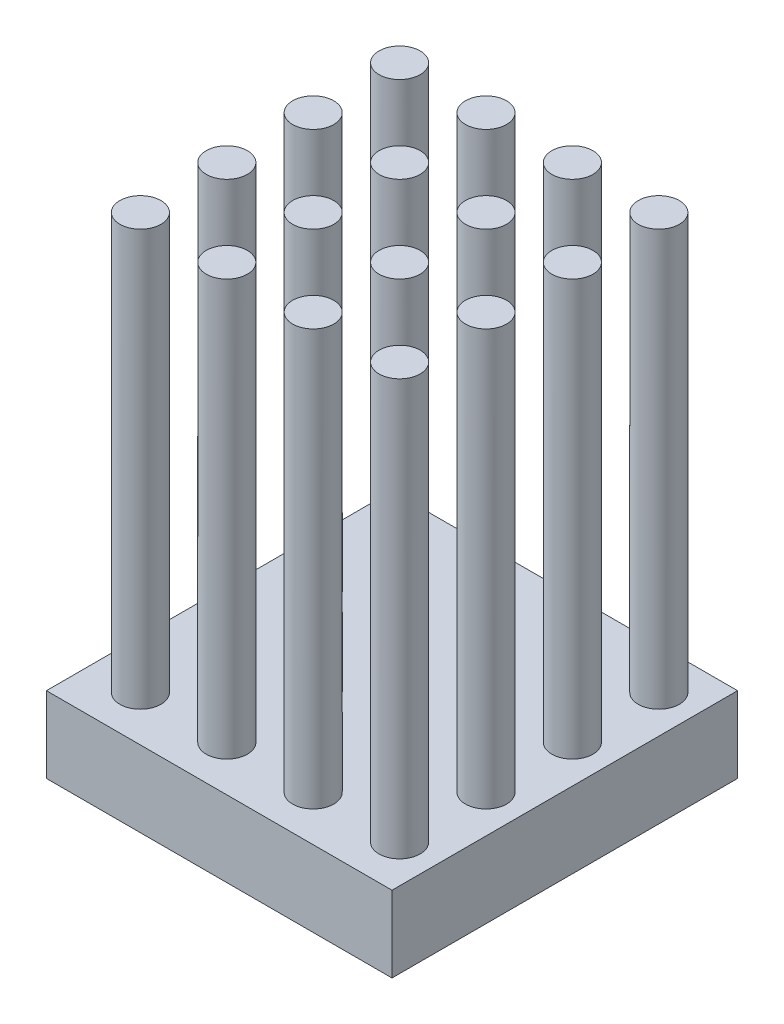
ISO-10303-21;
HEADER;
FILE_DESCRIPTION(('STEP AP214'),'2;1');
FILE_NAME('part.step','',(''),(''),'','','');
FILE_SCHEMA(('AUTOMOTIVE_DESIGN { 1 0 10303 214 1 1 1 1 }'));
ENDSEC;
DATA;
#1=APPLICATION_CONTEXT('core data for automotive mechanical design processes');
#2=APPLICATION_PROTOCOL_DEFINITION('international standard','automotive_design',2000,#1);
#3=PRODUCT_CONTEXT('',#1,'mechanical');
#4=PRODUCT('Part','Part','',(#3));
#5=PRODUCT_RELATED_PRODUCT_CATEGORY('part','',(#4));
#6=PRODUCT_DEFINITION_FORMATION('','',#4);
#7=PRODUCT_DEFINITION_CONTEXT('part definition',#1,'design');
#8=PRODUCT_DEFINITION('design','',#6,#7);
#9=PRODUCT_DEFINITION_SHAPE('','',#8);
#10=(LENGTH_UNIT() NAMED_UNIT(*) SI_UNIT(.MILLI.,.METRE.));
#11=(NAMED_UNIT(*) PLANE_ANGLE_UNIT() SI_UNIT($,.RADIAN.));
#12=(NAMED_UNIT(*) SI_UNIT($,.STERADIAN.) SOLID_ANGLE_UNIT());
#13=UNCERTAINTY_MEASURE_WITH_UNIT(LENGTH_MEASURE(1.E-05),#10,'distance_accuracy_value','');
#14=(GEOMETRIC_REPRESENTATION_CONTEXT(3) GLOBAL_UNCERTAINTY_ASSIGNED_CONTEXT((#13)) GLOBAL_UNIT_ASSIGNED_CONTEXT((#10,
#11,#12)) REPRESENTATION_CONTEXT('',''));
#15=CARTESIAN_POINT('',(0.,0.,0.));
#16=DIRECTION('',(0.,0.,1.));
#17=DIRECTION('',(1.,0.,0.));
#18=AXIS2_PLACEMENT_3D('',#15,#16,#17);
#19=CARTESIAN_POINT('',(0.,2.2,0.));
#20=DIRECTION('',(0.,-1.,0.));
#21=DIRECTION('',(0.,0.,-1.));
#22=AXIS2_PLACEMENT_3D('',#19,#20,#21);
#23=PLANE('',#22);
#24=CARTESIAN_POINT('',(-3.595,2.2,3.685));
#25=DIRECTION('',(0.,-1.,0.));
#26=DIRECTION('',(0.,0.,-1.));
#27=AXIS2_PLACEMENT_3D('',#24,#25,#26);
#28=CIRCLE('',#27,0.595);
#29=CARTESIAN_POINT('',(-3.595,2.2,3.09));
#30=VERTEX_POINT('',#29);
#31=EDGE_CURVE('E122',#30,#30,#28,.F.);
#32=ORIENTED_EDGE('',*,*,#31,.F.);
#33=EDGE_LOOP('',(#32));
#34=FACE_BOUND('',#33,.T.);
#35=DIRECTION('',(0.,0.,1.));
#36=VECTOR('',#35,1.);
#37=CARTESIAN_POINT('',(-5.,2.2,-5.));
#38=LINE('',#37,#36);
#39=CARTESIAN_POINT('',(-5.,2.2,-5.));
#40=VERTEX_POINT('',#39);
#41=CARTESIAN_POINT('',(-5.,2.2,5.));
#42=VERTEX_POINT('',#41);
#43=EDGE_CURVE('E97',#40,#42,#38,.T.);
#44=ORIENTED_EDGE('',*,*,#43,.T.);
#45=DIRECTION('',(1.,0.,0.));
#46=VECTOR('',#45,1.);
#47=CARTESIAN_POINT('',(5.,2.2,5.));
#48=LINE('',#47,#46);
#49=CARTESIAN_POINT('',(5.,2.2,5.));
#50=VERTEX_POINT('',#49);
#51=EDGE_CURVE('E92',#42,#50,#48,.T.);
#52=ORIENTED_EDGE('',*,*,#51,.T.);
#53=DIRECTION('',(0.,0.,-1.));
#54=VECTOR('',#53,1.);
#55=CARTESIAN_POINT('',(5.,2.2,-5.));
#56=LINE('',#55,#54);
#57=CARTESIAN_POINT('',(5.,2.2,-5.));
#58=VERTEX_POINT('',#57);
#59=EDGE_CURVE('E95',#50,#58,#56,.T.);
#60=ORIENTED_EDGE('',*,*,#59,.T.);
#61=DIRECTION('',(-1.,0.,0.));
#62=VECTOR('',#61,1.);
#63=CARTESIAN_POINT('',(5.,2.2,-5.));
#64=LINE('',#63,#62);
#65=EDGE_CURVE('E61',#58,#40,#64,.T.);
#66=ORIENTED_EDGE('',*,*,#65,.T.);
#67=EDGE_LOOP('',(#44,#52,#60,#66));
#68=FACE_BOUND('',#67,.T.);
#69=CARTESIAN_POINT('',(-1.095,2.2,3.685));
#70=DIRECTION('',(0.,-1.,0.));
#71=DIRECTION('',(0.,0.,-1.));
#72=AXIS2_PLACEMENT_3D('',#69,#70,#71);
#73=CIRCLE('',#72,0.595);
#74=CARTESIAN_POINT('',(-1.095,2.2,3.09));
#75=VERTEX_POINT('',#74);
#76=EDGE_CURVE('E125',#75,#75,#73,.F.);
#77=ORIENTED_EDGE('',*,*,#76,.F.);
#78=EDGE_LOOP('',(#77));
#79=FACE_BOUND('',#78,.T.);
#80=CARTESIAN_POINT('',(1.405,2.2,3.685));
#81=DIRECTION('',(0.,-1.,0.));
#82=DIRECTION('',(0.,0.,-1.));
#83=AXIS2_PLACEMENT_3D('',#80,#81,#82);
#84=CIRCLE('',#83,0.595);
#85=CARTESIAN_POINT('',(1.405,2.2,3.09));
#86=VERTEX_POINT('',#85);
#87=EDGE_CURVE('E128',#86,#86,#84,.F.);
#88=ORIENTED_EDGE('',*,*,#87,.F.);
#89=EDGE_LOOP('',(#88));
#90=FACE_BOUND('',#89,.T.);
#91=CARTESIAN_POINT('',(3.905,2.2,3.685));
#92=DIRECTION('',(0.,-1.,0.));
#93=DIRECTION('',(0.,0.,-1.));
#94=AXIS2_PLACEMENT_3D('',#91,#92,#93);
#95=CIRCLE('',#94,0.595);
#96=CARTESIAN_POINT('',(3.905,2.2,3.09));
#97=VERTEX_POINT('',#96);
#98=EDGE_CURVE('E134',#97,#97,#95,.F.);
#99=ORIENTED_EDGE('',*,*,#98,.F.);
#100=EDGE_LOOP('',(#99));
#101=FACE_BOUND('',#100,.T.);
#102=CARTESIAN_POINT('',(-3.595,2.2,1.185));
#103=DIRECTION('',(0.,-1.,0.));
#104=DIRECTION('',(0.,0.,-1.));
#105=AXIS2_PLACEMENT_3D('',#102,#103,#104);
#106=CIRCLE('',#105,0.595);
#107=CARTESIAN_POINT('',(-3.595,2.2,0.590000000000001));
#108=VERTEX_POINT('',#107);
#109=EDGE_CURVE('E140',#108,#108,#106,.F.);
#110=ORIENTED_EDGE('',*,*,#109,.F.);
#111=EDGE_LOOP('',(#110));
#112=FACE_BOUND('',#111,.T.);
#113=CARTESIAN_POINT('',(-1.095,2.2,1.185));
#114=DIRECTION('',(0.,-1.,0.));
#115=DIRECTION('',(0.,0.,-1.));
#116=AXIS2_PLACEMENT_3D('',#113,#114,#115);
#117=CIRCLE('',#116,0.595);
#118=CARTESIAN_POINT('',(-1.095,2.2,0.59));
#119=VERTEX_POINT('',#118);
#120=EDGE_CURVE('E146',#119,#119,#117,.F.);
#121=ORIENTED_EDGE('',*,*,#120,.F.);
#122=EDGE_LOOP('',(#121));
#123=FACE_BOUND('',#122,.T.);
#124=CARTESIAN_POINT('',(1.405,2.2,1.185));
#125=DIRECTION('',(0.,-1.,0.));
#126=DIRECTION('',(0.,0.,-1.));
#127=AXIS2_PLACEMENT_3D('',#124,#125,#126);
#128=CIRCLE('',#127,0.595);
#129=CARTESIAN_POINT('',(1.405,2.2,0.59));
#130=VERTEX_POINT('',#129);
#131=EDGE_CURVE('E152',#130,#130,#128,.F.);
#132=ORIENTED_EDGE('',*,*,#131,.F.);
#133=EDGE_LOOP('',(#132));
#134=FACE_BOUND('',#133,.T.);
#135=CARTESIAN_POINT('',(3.905,2.2,1.185));
#136=DIRECTION('',(0.,-1.,0.));
#137=DIRECTION('',(0.,0.,-1.));
#138=AXIS2_PLACEMENT_3D('',#135,#136,#137);
#139=CIRCLE('',#138,0.595);
#140=CARTESIAN_POINT('',(3.905,2.2,0.59));
#141=VERTEX_POINT('',#140);
#142=EDGE_CURVE('E158',#141,#141,#139,.F.);
#143=ORIENTED_EDGE('',*,*,#142,.F.);
#144=EDGE_LOOP('',(#143));
#145=FACE_BOUND('',#144,.T.);
#146=CARTESIAN_POINT('',(-3.595,2.2,-1.315));
#147=DIRECTION('',(0.,-1.,0.));
#148=DIRECTION('',(0.,0.,-1.));
#149=AXIS2_PLACEMENT_3D('',#146,#147,#148);
#150=CIRCLE('',#149,0.595);
#151=CARTESIAN_POINT('',(-3.595,2.2,-1.91));
#152=VERTEX_POINT('',#151);
#153=EDGE_CURVE('E164',#152,#152,#150,.F.);
#154=ORIENTED_EDGE('',*,*,#153,.F.);
#155=EDGE_LOOP('',(#154));
#156=FACE_BOUND('',#155,.T.);
#157=CARTESIAN_POINT('',(-1.095,2.2,-1.315));
#158=DIRECTION('',(0.,-1.,0.));
#159=DIRECTION('',(0.,0.,-1.));
#160=AXIS2_PLACEMENT_3D('',#157,#158,#159);
#161=CIRCLE('',#160,0.595);
#162=CARTESIAN_POINT('',(-1.095,2.2,-1.91));
#163=VERTEX_POINT('',#162);
#164=EDGE_CURVE('E170',#163,#163,#161,.F.);
#165=ORIENTED_EDGE('',*,*,#164,.F.);
#166=EDGE_LOOP('',(#165));
#167=FACE_BOUND('',#166,.T.);
#168=CARTESIAN_POINT('',(1.405,2.2,-1.315));
#169=DIRECTION('',(0.,-1.,0.));
#170=DIRECTION('',(0.,0.,-1.));
#171=AXIS2_PLACEMENT_3D('',#168,#169,#170);
#172=CIRCLE('',#171,0.595);
#173=CARTESIAN_POINT('',(1.405,2.2,-1.91));
#174=VERTEX_POINT('',#173);
#175=EDGE_CURVE('E176',#174,#174,#172,.F.);
#176=ORIENTED_EDGE('',*,*,#175,.F.);
#177=EDGE_LOOP('',(#176));
#178=FACE_BOUND('',#177,.T.);
#179=CARTESIAN_POINT('',(3.905,2.2,-1.315));
#180=DIRECTION('',(0.,-1.,0.));
#181=DIRECTION('',(0.,0.,-1.));
#182=AXIS2_PLACEMENT_3D('',#179,#180,#181);
#183=CIRCLE('',#182,0.595);
#184=CARTESIAN_POINT('',(3.905,2.2,-1.91));
#185=VERTEX_POINT('',#184);
#186=EDGE_CURVE('E182',#185,#185,#183,.F.);
#187=ORIENTED_EDGE('',*,*,#186,.F.);
#188=EDGE_LOOP('',(#187));
#189=FACE_BOUND('',#188,.T.);
#190=CARTESIAN_POINT('',(-3.595,2.2,-3.815));
#191=DIRECTION('',(0.,-1.,0.));
#192=DIRECTION('',(0.,0.,-1.));
#193=AXIS2_PLACEMENT_3D('',#190,#191,#192);
#194=CIRCLE('',#193,0.595);
#195=CARTESIAN_POINT('',(-3.595,2.2,-4.41));
#196=VERTEX_POINT('',#195);
#197=EDGE_CURVE('E188',#196,#196,#194,.F.);
#198=ORIENTED_EDGE('',*,*,#197,.F.);
#199=EDGE_LOOP('',(#198));
#200=FACE_BOUND('',#199,.T.);
#201=CARTESIAN_POINT('',(-1.095,2.2,-3.815));
#202=DIRECTION('',(0.,-1.,0.));
#203=DIRECTION('',(0.,0.,-1.));
#204=AXIS2_PLACEMENT_3D('',#201,#202,#203);
#205=CIRCLE('',#204,0.595);
#206=CARTESIAN_POINT('',(-1.095,2.2,-4.41));
#207=VERTEX_POINT('',#206);
#208=EDGE_CURVE('E194',#207,#207,#205,.F.);
#209=ORIENTED_EDGE('',*,*,#208,.F.);
#210=EDGE_LOOP('',(#209));
#211=FACE_BOUND('',#210,.T.);
#212=CARTESIAN_POINT('',(1.405,2.2,-3.815));
#213=DIRECTION('',(0.,-1.,0.));
#214=DIRECTION('',(0.,0.,-1.));
#215=AXIS2_PLACEMENT_3D('',#212,#213,#214);
#216=CIRCLE('',#215,0.595);
#217=CARTESIAN_POINT('',(1.405,2.2,-4.41));
#218=VERTEX_POINT('',#217);
#219=EDGE_CURVE('E200',#218,#218,#216,.F.);
#220=ORIENTED_EDGE('',*,*,#219,.F.);
#221=EDGE_LOOP('',(#220));
#222=FACE_BOUND('',#221,.T.);
#223=CARTESIAN_POINT('',(3.905,2.2,-3.815));
#224=DIRECTION('',(0.,-1.,0.));
#225=DIRECTION('',(0.,0.,-1.));
#226=AXIS2_PLACEMENT_3D('',#223,#224,#225);
#227=CIRCLE('',#226,0.595);
#228=CARTESIAN_POINT('',(3.905,2.2,-4.41));
#229=VERTEX_POINT('',#228);
#230=EDGE_CURVE('E53',#229,#229,#227,.F.);
#231=ORIENTED_EDGE('',*,*,#230,.F.);
#232=EDGE_LOOP('',(#231));
#233=FACE_BOUND('',#232,.T.);
#234=ADVANCED_FACE('F44',(#34,#68,#79,#90,#101,#112,#123,#134,#145,#156,#167,#178,#189,#200,
#211,#222,#233),#23,.F.);
#235=CARTESIAN_POINT('',(-5.,2.2,-5.));
#236=DIRECTION('',(1.,0.,0.));
#237=DIRECTION('',(0.,0.,-1.));
#238=AXIS2_PLACEMENT_3D('',#235,#236,#237);
#239=PLANE('',#238);
#240=DIRECTION('',(0.,0.,1.));
#241=VECTOR('',#240,1.);
#242=CARTESIAN_POINT('',(-5.,0.,-5.));
#243=LINE('',#242,#241);
#244=CARTESIAN_POINT('',(-5.,0.,-5.));
#245=VERTEX_POINT('',#244);
#246=CARTESIAN_POINT('',(-5.,0.,5.));
#247=VERTEX_POINT('',#246);
#248=EDGE_CURVE('E112',#245,#247,#243,.T.);
#249=ORIENTED_EDGE('',*,*,#248,.T.);
#250=DIRECTION('',(0.,-1.,0.));
#251=VECTOR('',#250,1.);
#252=CARTESIAN_POINT('',(-5.,2.2,5.));
#253=LINE('',#252,#251);
#254=EDGE_CURVE('E103',#42,#247,#253,.T.);
#255=ORIENTED_EDGE('',*,*,#254,.F.);
#256=ORIENTED_EDGE('',*,*,#43,.F.);
#257=DIRECTION('',(0.,-1.,0.));
#258=VECTOR('',#257,1.);
#259=CARTESIAN_POINT('',(-5.,2.2,-5.));
#260=LINE('',#259,#258);
#261=EDGE_CURVE('E108',#40,#245,#260,.T.);
#262=ORIENTED_EDGE('',*,*,#261,.T.);
#263=EDGE_LOOP('',(#249,#255,#256,#262));
#264=FACE_BOUND('',#263,.T.);
#265=ADVANCED_FACE('F211',(#264),#239,.F.);
#266=CARTESIAN_POINT('',(5.,2.2,5.));
#267=DIRECTION('',(0.,0.,-1.));
#268=DIRECTION('',(-1.,0.,0.));
#269=AXIS2_PLACEMENT_3D('',#266,#267,#268);
#270=PLANE('',#269);
#271=DIRECTION('',(1.,0.,0.));
#272=VECTOR('',#271,1.);
#273=CARTESIAN_POINT('',(5.,0.,5.));
#274=LINE('',#273,#272);
#275=CARTESIAN_POINT('',(5.,0.,5.));
#276=VERTEX_POINT('',#275);
#277=EDGE_CURVE('E102',#247,#276,#274,.T.);
#278=ORIENTED_EDGE('',*,*,#277,.T.);
#279=DIRECTION('',(0.,-1.,0.));
#280=VECTOR('',#279,1.);
#281=CARTESIAN_POINT('',(5.,2.2,5.));
#282=LINE('',#281,#280);
#283=EDGE_CURVE('E100',#50,#276,#282,.T.);
#284=ORIENTED_EDGE('',*,*,#283,.F.);
#285=ORIENTED_EDGE('',*,*,#51,.F.);
#286=ORIENTED_EDGE('',*,*,#254,.T.);
#287=EDGE_LOOP('',(#278,#284,#285,#286));
#288=FACE_BOUND('',#287,.T.);
#289=ADVANCED_FACE('F101',(#288),#270,.F.);
#290=CARTESIAN_POINT('',(5.,2.2,-5.));
#291=DIRECTION('',(-1.,0.,0.));
#292=DIRECTION('',(0.,0.,1.));
#293=AXIS2_PLACEMENT_3D('',#290,#291,#292);
#294=PLANE('',#293);
#295=DIRECTION('',(0.,0.,-1.));
#296=VECTOR('',#295,1.);
#297=CARTESIAN_POINT('',(5.,0.,-5.));
#298=LINE('',#297,#296);
#299=CARTESIAN_POINT('',(5.,0.,-5.));
#300=VERTEX_POINT('',#299);
#301=EDGE_CURVE('E78',#276,#300,#298,.T.);
#302=ORIENTED_EDGE('',*,*,#301,.T.);
#303=DIRECTION('',(0.,-1.,0.));
#304=VECTOR('',#303,1.);
#305=CARTESIAN_POINT('',(5.,2.2,-5.));
#306=LINE('',#305,#304);
#307=EDGE_CURVE('E104',#58,#300,#306,.T.);
#308=ORIENTED_EDGE('',*,*,#307,.F.);
#309=ORIENTED_EDGE('',*,*,#59,.F.);
#310=ORIENTED_EDGE('',*,*,#283,.T.);
#311=EDGE_LOOP('',(#302,#308,#309,#310));
#312=FACE_BOUND('',#311,.T.);
#313=ADVANCED_FACE('F106',(#312),#294,.F.);
#314=CARTESIAN_POINT('',(5.,2.2,-5.));
#315=DIRECTION('',(0.,0.,1.));
#316=DIRECTION('',(1.,0.,0.));
#317=AXIS2_PLACEMENT_3D('',#314,#315,#316);
#318=PLANE('',#317);
#319=DIRECTION('',(-1.,0.,0.));
#320=VECTOR('',#319,1.);
#321=CARTESIAN_POINT('',(5.,0.,-5.));
#322=LINE('',#321,#320);
#323=EDGE_CURVE('E84',#300,#245,#322,.T.);
#324=ORIENTED_EDGE('',*,*,#323,.T.);
#325=ORIENTED_EDGE('',*,*,#261,.F.);
#326=ORIENTED_EDGE('',*,*,#65,.F.);
#327=ORIENTED_EDGE('',*,*,#307,.T.);
#328=EDGE_LOOP('',(#324,#325,#326,#327));
#329=FACE_BOUND('',#328,.T.);
#330=ADVANCED_FACE('F227',(#329),#318,.F.);
#331=CARTESIAN_POINT('',(0.,0.,0.));
#332=DIRECTION('',(0.,-1.,0.));
#333=DIRECTION('',(0.,0.,-1.));
#334=AXIS2_PLACEMENT_3D('',#331,#332,#333);
#335=PLANE('',#334);
#336=ORIENTED_EDGE('',*,*,#248,.F.);
#337=ORIENTED_EDGE('',*,*,#323,.F.);
#338=ORIENTED_EDGE('',*,*,#301,.F.);
#339=ORIENTED_EDGE('',*,*,#277,.F.);
#340=EDGE_LOOP('',(#336,#337,#338,#339));
#341=FACE_BOUND('',#340,.T.);
#342=ADVANCED_FACE('F224',(#341),#335,.T.);
#343=CARTESIAN_POINT('',(-3.595,14.23,3.685));
#344=DIRECTION('',(0.,-1.,0.));
#345=DIRECTION('',(0.,0.,-1.));
#346=AXIS2_PLACEMENT_3D('',#343,#344,#345);
#347=CYLINDRICAL_SURFACE('',#346,0.595);
#348=CARTESIAN_POINT('',(-3.595,14.23,3.685));
#349=DIRECTION('',(0.,1.,0.));
#350=DIRECTION('',(0.,0.,1.));
#351=AXIS2_PLACEMENT_3D('',#348,#349,#350);
#352=CIRCLE('',#351,0.595);
#353=CARTESIAN_POINT('',(-3.595,14.23,4.28));
#354=VERTEX_POINT('',#353);
#355=EDGE_CURVE('E115',#354,#354,#352,.T.);
#356=ORIENTED_EDGE('',*,*,#355,.F.);
#357=EDGE_LOOP('',(#356));
#358=FACE_BOUND('',#357,.T.);
#359=ORIENTED_EDGE('',*,*,#31,.T.);
#360=EDGE_LOOP('',(#359));
#361=FACE_BOUND('',#360,.T.);
#362=ADVANCED_FACE('F222',(#358,#361),#347,.T.);
#363=CARTESIAN_POINT('',(-3.595,14.23,3.685));
#364=DIRECTION('',(0.,1.,0.));
#365=DIRECTION('',(0.,0.,1.));
#366=AXIS2_PLACEMENT_3D('',#363,#364,#365);
#367=PLANE('',#366);
#368=ORIENTED_EDGE('',*,*,#355,.T.);
#369=EDGE_LOOP('',(#368));
#370=FACE_BOUND('',#369,.T.);
#371=ADVANCED_FACE('F466',(#370),#367,.T.);
#372=CARTESIAN_POINT('',(-1.095,14.23,3.685));
#373=DIRECTION('',(0.,-1.,0.));
#374=DIRECTION('',(0.,0.,-1.));
#375=AXIS2_PLACEMENT_3D('',#372,#373,#374);
#376=CYLINDRICAL_SURFACE('',#375,0.595);
#377=CARTESIAN_POINT('',(-1.095,14.23,3.685));
#378=DIRECTION('',(0.,1.,0.));
#379=DIRECTION('',(0.,0.,1.));
#380=AXIS2_PLACEMENT_3D('',#377,#378,#379);
#381=CIRCLE('',#380,0.595);
#382=CARTESIAN_POINT('',(-1.095,14.23,4.28));
#383=VERTEX_POINT('',#382);
#384=EDGE_CURVE('E585',#383,#383,#381,.T.);
#385=ORIENTED_EDGE('',*,*,#384,.F.);
#386=EDGE_LOOP('',(#385));
#387=FACE_BOUND('',#386,.T.);
#388=ORIENTED_EDGE('',*,*,#76,.T.);
#389=EDGE_LOOP('',(#388));
#390=FACE_BOUND('',#389,.T.);
#391=ADVANCED_FACE('F458',(#387,#390),#376,.T.);
#392=CARTESIAN_POINT('',(-1.095,14.23,3.685));
#393=DIRECTION('',(0.,1.,0.));
#394=DIRECTION('',(0.,0.,1.));
#395=AXIS2_PLACEMENT_3D('',#392,#393,#394);
#396=PLANE('',#395);
#397=ORIENTED_EDGE('',*,*,#384,.T.);
#398=EDGE_LOOP('',(#397));
#399=FACE_BOUND('',#398,.T.);
#400=ADVANCED_FACE('F243',(#399),#396,.T.);
#401=CARTESIAN_POINT('',(1.405,14.23,3.685));
#402=DIRECTION('',(0.,1.,0.));
#403=DIRECTION('',(0.,0.,1.));
#404=AXIS2_PLACEMENT_3D('',#401,#402,#403);
#405=PLANE('',#404);
#406=CARTESIAN_POINT('',(1.405,14.23,3.685));
#407=DIRECTION('',(0.,1.,0.));
#408=DIRECTION('',(0.,0.,1.));
#409=AXIS2_PLACEMENT_3D('',#406,#407,#408);
#410=CIRCLE('',#409,0.595);
#411=CARTESIAN_POINT('',(1.405,14.23,4.28));
#412=VERTEX_POINT('',#411);
#413=EDGE_CURVE('E131',#412,#412,#410,.T.);
#414=ORIENTED_EDGE('',*,*,#413,.T.);
#415=EDGE_LOOP('',(#414));
#416=FACE_BOUND('',#415,.T.);
#417=ADVANCED_FACE('F239',(#416),#405,.T.);
#418=CARTESIAN_POINT('',(1.405,14.23,3.685));
#419=DIRECTION('',(0.,-1.,0.));
#420=DIRECTION('',(0.,0.,-1.));
#421=AXIS2_PLACEMENT_3D('',#418,#419,#420);
#422=CYLINDRICAL_SURFACE('',#421,0.595);
#423=ORIENTED_EDGE('',*,*,#413,.F.);
#424=EDGE_LOOP('',(#423));
#425=FACE_BOUND('',#424,.T.);
#426=ORIENTED_EDGE('',*,*,#87,.T.);
#427=EDGE_LOOP('',(#426));
#428=FACE_BOUND('',#427,.T.);
#429=ADVANCED_FACE('F235',(#425,#428),#422,.T.);
#430=CARTESIAN_POINT('',(3.905,14.23,3.685));
#431=DIRECTION('',(0.,1.,0.));
#432=DIRECTION('',(0.,0.,1.));
#433=AXIS2_PLACEMENT_3D('',#430,#431,#432);
#434=PLANE('',#433);
#435=CARTESIAN_POINT('',(3.905,14.23,3.685));
#436=DIRECTION('',(0.,1.,0.));
#437=DIRECTION('',(0.,0.,1.));
#438=AXIS2_PLACEMENT_3D('',#435,#436,#437);
#439=CIRCLE('',#438,0.595);
#440=CARTESIAN_POINT('',(3.905,14.23,4.28));
#441=VERTEX_POINT('',#440);
#442=EDGE_CURVE('E137',#441,#441,#439,.T.);
#443=ORIENTED_EDGE('',*,*,#442,.T.);
#444=EDGE_LOOP('',(#443));
#445=FACE_BOUND('',#444,.T.);
#446=ADVANCED_FACE('F238',(#445),#434,.T.);
#447=CARTESIAN_POINT('',(3.905,14.23,3.685));
#448=DIRECTION('',(0.,-1.,0.));
#449=DIRECTION('',(0.,0.,-1.));
#450=AXIS2_PLACEMENT_3D('',#447,#448,#449);
#451=CYLINDRICAL_SURFACE('',#450,0.595);
#452=ORIENTED_EDGE('',*,*,#442,.F.);
#453=EDGE_LOOP('',(#452));
#454=FACE_BOUND('',#453,.T.);
#455=ORIENTED_EDGE('',*,*,#98,.T.);
#456=EDGE_LOOP('',(#455));
#457=FACE_BOUND('',#456,.T.);
#458=ADVANCED_FACE('F245',(#454,#457),#451,.T.);
#459=CARTESIAN_POINT('',(-3.595,14.23,1.185));
#460=DIRECTION('',(0.,1.,0.));
#461=DIRECTION('',(0.,0.,1.));
#462=AXIS2_PLACEMENT_3D('',#459,#460,#461);
#463=PLANE('',#462);
#464=CARTESIAN_POINT('',(-3.595,14.23,1.185));
#465=DIRECTION('',(0.,1.,0.));
#466=DIRECTION('',(0.,0.,1.));
#467=AXIS2_PLACEMENT_3D('',#464,#465,#466);
#468=CIRCLE('',#467,0.595);
#469=CARTESIAN_POINT('',(-3.595,14.23,1.78));
#470=VERTEX_POINT('',#469);
#471=EDGE_CURVE('E143',#470,#470,#468,.T.);
#472=ORIENTED_EDGE('',*,*,#471,.T.);
#473=EDGE_LOOP('',(#472));
#474=FACE_BOUND('',#473,.T.);
#475=ADVANCED_FACE('F248',(#474),#463,.T.);
#476=CARTESIAN_POINT('',(-3.595,14.23,1.185));
#477=DIRECTION('',(0.,-1.,0.));
#478=DIRECTION('',(0.,0.,-1.));
#479=AXIS2_PLACEMENT_3D('',#476,#477,#478);
#480=CYLINDRICAL_SURFACE('',#479,0.595);
#481=ORIENTED_EDGE('',*,*,#471,.F.);
#482=EDGE_LOOP('',(#481));
#483=FACE_BOUND('',#482,.T.);
#484=ORIENTED_EDGE('',*,*,#109,.T.);
#485=EDGE_LOOP('',(#484));
#486=FACE_BOUND('',#485,.T.);
#487=ADVANCED_FACE('F253',(#483,#486),#480,.T.);
#488=CARTESIAN_POINT('',(-1.095,14.23,1.185));
#489=DIRECTION('',(0.,1.,0.));
#490=DIRECTION('',(0.,0.,1.));
#491=AXIS2_PLACEMENT_3D('',#488,#489,#490);
#492=PLANE('',#491);
#493=CARTESIAN_POINT('',(-1.095,14.23,1.185));
#494=DIRECTION('',(0.,1.,0.));
#495=DIRECTION('',(0.,0.,1.));
#496=AXIS2_PLACEMENT_3D('',#493,#494,#495);
#497=CIRCLE('',#496,0.595);
#498=CARTESIAN_POINT('',(-1.095,14.23,1.78));
#499=VERTEX_POINT('',#498);
#500=EDGE_CURVE('E149',#499,#499,#497,.T.);
#501=ORIENTED_EDGE('',*,*,#500,.T.);
#502=EDGE_LOOP('',(#501));
#503=FACE_BOUND('',#502,.T.);
#504=ADVANCED_FACE('F256',(#503),#492,.T.);
#505=CARTESIAN_POINT('',(-1.095,14.23,1.185));
#506=DIRECTION('',(0.,-1.,0.));
#507=DIRECTION('',(0.,0.,-1.));
#508=AXIS2_PLACEMENT_3D('',#505,#506,#507);
#509=CYLINDRICAL_SURFACE('',#508,0.595);
#510=ORIENTED_EDGE('',*,*,#500,.F.);
#511=EDGE_LOOP('',(#510));
#512=FACE_BOUND('',#511,.T.);
#513=ORIENTED_EDGE('',*,*,#120,.T.);
#514=EDGE_LOOP('',(#513));
#515=FACE_BOUND('',#514,.T.);
#516=ADVANCED_FACE('F261',(#512,#515),#509,.T.);
#517=CARTESIAN_POINT('',(1.405,14.23,1.185));
#518=DIRECTION('',(0.,1.,0.));
#519=DIRECTION('',(0.,0.,1.));
#520=AXIS2_PLACEMENT_3D('',#517,#518,#519);
#521=PLANE('',#520);
#522=CARTESIAN_POINT('',(1.405,14.23,1.185));
#523=DIRECTION('',(0.,1.,0.));
#524=DIRECTION('',(0.,0.,1.));
#525=AXIS2_PLACEMENT_3D('',#522,#523,#524);
#526=CIRCLE('',#525,0.595);
#527=CARTESIAN_POINT('',(1.405,14.23,1.78));
#528=VERTEX_POINT('',#527);
#529=EDGE_CURVE('E155',#528,#528,#526,.T.);
#530=ORIENTED_EDGE('',*,*,#529,.T.);
#531=EDGE_LOOP('',(#530));
#532=FACE_BOUND('',#531,.T.);
#533=ADVANCED_FACE('F264',(#532),#521,.T.);
#534=CARTESIAN_POINT('',(1.405,14.23,1.185));
#535=DIRECTION('',(0.,-1.,0.));
#536=DIRECTION('',(0.,0.,-1.));
#537=AXIS2_PLACEMENT_3D('',#534,#535,#536);
#538=CYLINDRICAL_SURFACE('',#537,0.595);
#539=ORIENTED_EDGE('',*,*,#529,.F.);
#540=EDGE_LOOP('',(#539));
#541=FACE_BOUND('',#540,.T.);
#542=ORIENTED_EDGE('',*,*,#131,.T.);
#543=EDGE_LOOP('',(#542));
#544=FACE_BOUND('',#543,.T.);
#545=ADVANCED_FACE('F269',(#541,#544),#538,.T.);
#546=CARTESIAN_POINT('',(3.905,14.23,1.185));
#547=DIRECTION('',(0.,1.,0.));
#548=DIRECTION('',(0.,0.,1.));
#549=AXIS2_PLACEMENT_3D('',#546,#547,#548);
#550=PLANE('',#549);
#551=CARTESIAN_POINT('',(3.905,14.23,1.185));
#552=DIRECTION('',(0.,1.,0.));
#553=DIRECTION('',(0.,0.,1.));
#554=AXIS2_PLACEMENT_3D('',#551,#552,#553);
#555=CIRCLE('',#554,0.595);
#556=CARTESIAN_POINT('',(3.905,14.23,1.78));
#557=VERTEX_POINT('',#556);
#558=EDGE_CURVE('E161',#557,#557,#555,.T.);
#559=ORIENTED_EDGE('',*,*,#558,.T.);
#560=EDGE_LOOP('',(#559));
#561=FACE_BOUND('',#560,.T.);
#562=ADVANCED_FACE('F272',(#561),#550,.T.);
#563=CARTESIAN_POINT('',(3.905,14.23,1.185));
#564=DIRECTION('',(0.,-1.,0.));
#565=DIRECTION('',(0.,0.,-1.));
#566=AXIS2_PLACEMENT_3D('',#563,#564,#565);
#567=CYLINDRICAL_SURFACE('',#566,0.595);
#568=ORIENTED_EDGE('',*,*,#558,.F.);
#569=EDGE_LOOP('',(#568));
#570=FACE_BOUND('',#569,.T.);
#571=ORIENTED_EDGE('',*,*,#142,.T.);
#572=EDGE_LOOP('',(#571));
#573=FACE_BOUND('',#572,.T.);
#574=ADVANCED_FACE('F277',(#570,#573),#567,.T.);
#575=CARTESIAN_POINT('',(-3.595,14.23,-1.315));
#576=DIRECTION('',(0.,1.,0.));
#577=DIRECTION('',(0.,0.,1.));
#578=AXIS2_PLACEMENT_3D('',#575,#576,#577);
#579=PLANE('',#578);
#580=CARTESIAN_POINT('',(-3.595,14.23,-1.315));
#581=DIRECTION('',(0.,1.,0.));
#582=DIRECTION('',(0.,0.,1.));
#583=AXIS2_PLACEMENT_3D('',#580,#581,#582);
#584=CIRCLE('',#583,0.595);
#585=CARTESIAN_POINT('',(-3.595,14.23,-0.719999999999999));
#586=VERTEX_POINT('',#585);
#587=EDGE_CURVE('E167',#586,#586,#584,.T.);
#588=ORIENTED_EDGE('',*,*,#587,.T.);
#589=EDGE_LOOP('',(#588));
#590=FACE_BOUND('',#589,.T.);
#591=ADVANCED_FACE('F280',(#590),#579,.T.);
#592=CARTESIAN_POINT('',(-3.595,14.23,-1.315));
#593=DIRECTION('',(0.,-1.,0.));
#594=DIRECTION('',(0.,0.,-1.));
#595=AXIS2_PLACEMENT_3D('',#592,#593,#594);
#596=CYLINDRICAL_SURFACE('',#595,0.595);
#597=ORIENTED_EDGE('',*,*,#587,.F.);
#598=EDGE_LOOP('',(#597));
#599=FACE_BOUND('',#598,.T.);
#600=ORIENTED_EDGE('',*,*,#153,.T.);
#601=EDGE_LOOP('',(#600));
#602=FACE_BOUND('',#601,.T.);
#603=ADVANCED_FACE('F285',(#599,#602),#596,.T.);
#604=CARTESIAN_POINT('',(-1.095,14.23,-1.315));
#605=DIRECTION('',(0.,1.,0.));
#606=DIRECTION('',(0.,0.,1.));
#607=AXIS2_PLACEMENT_3D('',#604,#605,#606);
#608=PLANE('',#607);
#609=CARTESIAN_POINT('',(-1.095,14.23,-1.315));
#610=DIRECTION('',(0.,1.,0.));
#611=DIRECTION('',(0.,0.,1.));
#612=AXIS2_PLACEMENT_3D('',#609,#610,#611);
#613=CIRCLE('',#612,0.595);
#614=CARTESIAN_POINT('',(-1.095,14.23,-0.719999999999999));
#615=VERTEX_POINT('',#614);
#616=EDGE_CURVE('E173',#615,#615,#613,.T.);
#617=ORIENTED_EDGE('',*,*,#616,.T.);
#618=EDGE_LOOP('',(#617));
#619=FACE_BOUND('',#618,.T.);
#620=ADVANCED_FACE('F288',(#619),#608,.T.);
#621=CARTESIAN_POINT('',(-1.095,14.23,-1.315));
#622=DIRECTION('',(0.,-1.,0.));
#623=DIRECTION('',(0.,0.,-1.));
#624=AXIS2_PLACEMENT_3D('',#621,#622,#623);
#625=CYLINDRICAL_SURFACE('',#624,0.595);
#626=ORIENTED_EDGE('',*,*,#616,.F.);
#627=EDGE_LOOP('',(#626));
#628=FACE_BOUND('',#627,.T.);
#629=ORIENTED_EDGE('',*,*,#164,.T.);
#630=EDGE_LOOP('',(#629));
#631=FACE_BOUND('',#630,.T.);
#632=ADVANCED_FACE('F293',(#628,#631),#625,.T.);
#633=CARTESIAN_POINT('',(1.405,14.23,-1.315));
#634=DIRECTION('',(0.,1.,0.));
#635=DIRECTION('',(0.,0.,1.));
#636=AXIS2_PLACEMENT_3D('',#633,#634,#635);
#637=PLANE('',#636);
#638=CARTESIAN_POINT('',(1.405,14.23,-1.315));
#639=DIRECTION('',(0.,1.,0.));
#640=DIRECTION('',(0.,0.,1.));
#641=AXIS2_PLACEMENT_3D('',#638,#639,#640);
#642=CIRCLE('',#641,0.595);
#643=CARTESIAN_POINT('',(1.405,14.23,-0.72));
#644=VERTEX_POINT('',#643);
#645=EDGE_CURVE('E179',#644,#644,#642,.T.);
#646=ORIENTED_EDGE('',*,*,#645,.T.);
#647=EDGE_LOOP('',(#646));
#648=FACE_BOUND('',#647,.T.);
#649=ADVANCED_FACE('F296',(#648),#637,.T.);
#650=CARTESIAN_POINT('',(1.405,14.23,-1.315));
#651=DIRECTION('',(0.,-1.,0.));
#652=DIRECTION('',(0.,0.,-1.));
#653=AXIS2_PLACEMENT_3D('',#650,#651,#652);
#654=CYLINDRICAL_SURFACE('',#653,0.595);
#655=ORIENTED_EDGE('',*,*,#645,.F.);
#656=EDGE_LOOP('',(#655));
#657=FACE_BOUND('',#656,.T.);
#658=ORIENTED_EDGE('',*,*,#175,.T.);
#659=EDGE_LOOP('',(#658));
#660=FACE_BOUND('',#659,.T.);
#661=ADVANCED_FACE('F301',(#657,#660),#654,.T.);
#662=CARTESIAN_POINT('',(3.905,14.23,-1.315));
#663=DIRECTION('',(0.,1.,0.));
#664=DIRECTION('',(0.,0.,1.));
#665=AXIS2_PLACEMENT_3D('',#662,#663,#664);
#666=PLANE('',#665);
#667=CARTESIAN_POINT('',(3.905,14.23,-1.315));
#668=DIRECTION('',(0.,1.,0.));
#669=DIRECTION('',(0.,0.,1.));
#670=AXIS2_PLACEMENT_3D('',#667,#668,#669);
#671=CIRCLE('',#670,0.595);
#672=CARTESIAN_POINT('',(3.905,14.23,-0.72));
#673=VERTEX_POINT('',#672);
#674=EDGE_CURVE('E185',#673,#673,#671,.T.);
#675=ORIENTED_EDGE('',*,*,#674,.T.);
#676=EDGE_LOOP('',(#675));
#677=FACE_BOUND('',#676,.T.);
#678=ADVANCED_FACE('F304',(#677),#666,.T.);
#679=CARTESIAN_POINT('',(3.905,14.23,-1.315));
#680=DIRECTION('',(0.,-1.,0.));
#681=DIRECTION('',(0.,0.,-1.));
#682=AXIS2_PLACEMENT_3D('',#679,#680,#681);
#683=CYLINDRICAL_SURFACE('',#682,0.595);
#684=ORIENTED_EDGE('',*,*,#674,.F.);
#685=EDGE_LOOP('',(#684));
#686=FACE_BOUND('',#685,.T.);
#687=ORIENTED_EDGE('',*,*,#186,.T.);
#688=EDGE_LOOP('',(#687));
#689=FACE_BOUND('',#688,.T.);
#690=ADVANCED_FACE('F309',(#686,#689),#683,.T.);
#691=CARTESIAN_POINT('',(-3.595,14.23,-3.815));
#692=DIRECTION('',(0.,1.,0.));
#693=DIRECTION('',(0.,0.,1.));
#694=AXIS2_PLACEMENT_3D('',#691,#692,#693);
#695=PLANE('',#694);
#696=CARTESIAN_POINT('',(-3.595,14.23,-3.815));
#697=DIRECTION('',(0.,1.,0.));
#698=DIRECTION('',(0.,0.,1.));
#699=AXIS2_PLACEMENT_3D('',#696,#697,#698);
#700=CIRCLE('',#699,0.595);
#701=CARTESIAN_POINT('',(-3.595,14.23,-3.22));
#702=VERTEX_POINT('',#701);
#703=EDGE_CURVE('E191',#702,#702,#700,.T.);
#704=ORIENTED_EDGE('',*,*,#703,.T.);
#705=EDGE_LOOP('',(#704));
#706=FACE_BOUND('',#705,.T.);
#707=ADVANCED_FACE('F312',(#706),#695,.T.);
#708=CARTESIAN_POINT('',(-3.595,14.23,-3.815));
#709=DIRECTION('',(0.,-1.,0.));
#710=DIRECTION('',(0.,0.,-1.));
#711=AXIS2_PLACEMENT_3D('',#708,#709,#710);
#712=CYLINDRICAL_SURFACE('',#711,0.595);
#713=ORIENTED_EDGE('',*,*,#703,.F.);
#714=EDGE_LOOP('',(#713));
#715=FACE_BOUND('',#714,.T.);
#716=ORIENTED_EDGE('',*,*,#197,.T.);
#717=EDGE_LOOP('',(#716));
#718=FACE_BOUND('',#717,.T.);
#719=ADVANCED_FACE('F317',(#715,#718),#712,.T.);
#720=CARTESIAN_POINT('',(-1.095,14.23,-3.815));
#721=DIRECTION('',(0.,1.,0.));
#722=DIRECTION('',(0.,0.,1.));
#723=AXIS2_PLACEMENT_3D('',#720,#721,#722);
#724=PLANE('',#723);
#725=CARTESIAN_POINT('',(-1.095,14.23,-3.815));
#726=DIRECTION('',(0.,1.,0.));
#727=DIRECTION('',(0.,0.,1.));
#728=AXIS2_PLACEMENT_3D('',#725,#726,#727);
#729=CIRCLE('',#728,0.595);
#730=CARTESIAN_POINT('',(-1.095,14.23,-3.22));
#731=VERTEX_POINT('',#730);
#732=EDGE_CURVE('E197',#731,#731,#729,.T.);
#733=ORIENTED_EDGE('',*,*,#732,.T.);
#734=EDGE_LOOP('',(#733));
#735=FACE_BOUND('',#734,.T.);
#736=ADVANCED_FACE('F320',(#735),#724,.T.);
#737=CARTESIAN_POINT('',(-1.095,14.23,-3.815));
#738=DIRECTION('',(0.,-1.,0.));
#739=DIRECTION('',(0.,0.,-1.));
#740=AXIS2_PLACEMENT_3D('',#737,#738,#739);
#741=CYLINDRICAL_SURFACE('',#740,0.595);
#742=ORIENTED_EDGE('',*,*,#732,.F.);
#743=EDGE_LOOP('',(#742));
#744=FACE_BOUND('',#743,.T.);
#745=ORIENTED_EDGE('',*,*,#208,.T.);
#746=EDGE_LOOP('',(#745));
#747=FACE_BOUND('',#746,.T.);
#748=ADVANCED_FACE('F325',(#744,#747),#741,.T.);
#749=CARTESIAN_POINT('',(1.405,14.23,-3.815));
#750=DIRECTION('',(0.,1.,0.));
#751=DIRECTION('',(0.,0.,1.));
#752=AXIS2_PLACEMENT_3D('',#749,#750,#751);
#753=PLANE('',#752);
#754=CARTESIAN_POINT('',(1.405,14.23,-3.815));
#755=DIRECTION('',(0.,1.,0.));
#756=DIRECTION('',(0.,0.,1.));
#757=AXIS2_PLACEMENT_3D('',#754,#755,#756);
#758=CIRCLE('',#757,0.595);
#759=CARTESIAN_POINT('',(1.405,14.23,-3.22));
#760=VERTEX_POINT('',#759);
#761=EDGE_CURVE('E203',#760,#760,#758,.T.);
#762=ORIENTED_EDGE('',*,*,#761,.T.);
#763=EDGE_LOOP('',(#762));
#764=FACE_BOUND('',#763,.T.);
#765=ADVANCED_FACE('F328',(#764),#753,.T.);
#766=CARTESIAN_POINT('',(1.405,14.23,-3.815));
#767=DIRECTION('',(0.,-1.,0.));
#768=DIRECTION('',(0.,0.,-1.));
#769=AXIS2_PLACEMENT_3D('',#766,#767,#768);
#770=CYLINDRICAL_SURFACE('',#769,0.595);
#771=ORIENTED_EDGE('',*,*,#761,.F.);
#772=EDGE_LOOP('',(#771));
#773=FACE_BOUND('',#772,.T.);
#774=ORIENTED_EDGE('',*,*,#219,.T.);
#775=EDGE_LOOP('',(#774));
#776=FACE_BOUND('',#775,.T.);
#777=ADVANCED_FACE('F333',(#773,#776),#770,.T.);
#778=CARTESIAN_POINT('',(3.905,14.23,-3.815));
#779=DIRECTION('',(0.,1.,0.));
#780=DIRECTION('',(0.,0.,1.));
#781=AXIS2_PLACEMENT_3D('',#778,#779,#780);
#782=PLANE('',#781);
#783=CARTESIAN_POINT('',(3.905,14.23,-3.815));
#784=DIRECTION('',(0.,1.,0.));
#785=DIRECTION('',(0.,0.,1.));
#786=AXIS2_PLACEMENT_3D('',#783,#784,#785);
#787=CIRCLE('',#786,0.595);
#788=CARTESIAN_POINT('',(3.905,14.23,-3.22));
#789=VERTEX_POINT('',#788);
#790=EDGE_CURVE('E13',#789,#789,#787,.T.);
#791=ORIENTED_EDGE('',*,*,#790,.T.);
#792=EDGE_LOOP('',(#791));
#793=FACE_BOUND('',#792,.T.);
#794=ADVANCED_FACE('F46',(#793),#782,.T.);
#795=CARTESIAN_POINT('',(3.905,14.23,-3.815));
#796=DIRECTION('',(0.,-1.,0.));
#797=DIRECTION('',(0.,0.,-1.));
#798=AXIS2_PLACEMENT_3D('',#795,#796,#797);
#799=CYLINDRICAL_SURFACE('',#798,0.595);
#800=ORIENTED_EDGE('',*,*,#790,.F.);
#801=EDGE_LOOP('',(#800));
#802=FACE_BOUND('',#801,.T.);
#803=ORIENTED_EDGE('',*,*,#230,.T.);
#804=EDGE_LOOP('',(#803));
#805=FACE_BOUND('',#804,.T.);
#806=ADVANCED_FACE('F208',(#802,#805),#799,.T.);
#807=CLOSED_SHELL('',(#234,#265,#289,#313,#330,#342,#362,#371,#391,#400,#417,#429,#446,#458,
#475,#487,#504,#516,#533,#545,#562,#574,#591,#603,#620,#632,#649,#661,#678,#690,#707,#719,#736,
#748,#765,#777,#794,#806));
#808=MANIFOLD_SOLID_BREP('B2',#807);
#809=ADVANCED_BREP_SHAPE_REPRESENTATION('',(#18,#808),#14);
#810=SHAPE_DEFINITION_REPRESENTATION(#9,#809);
ENDSEC;
END-ISO-10303-21;
